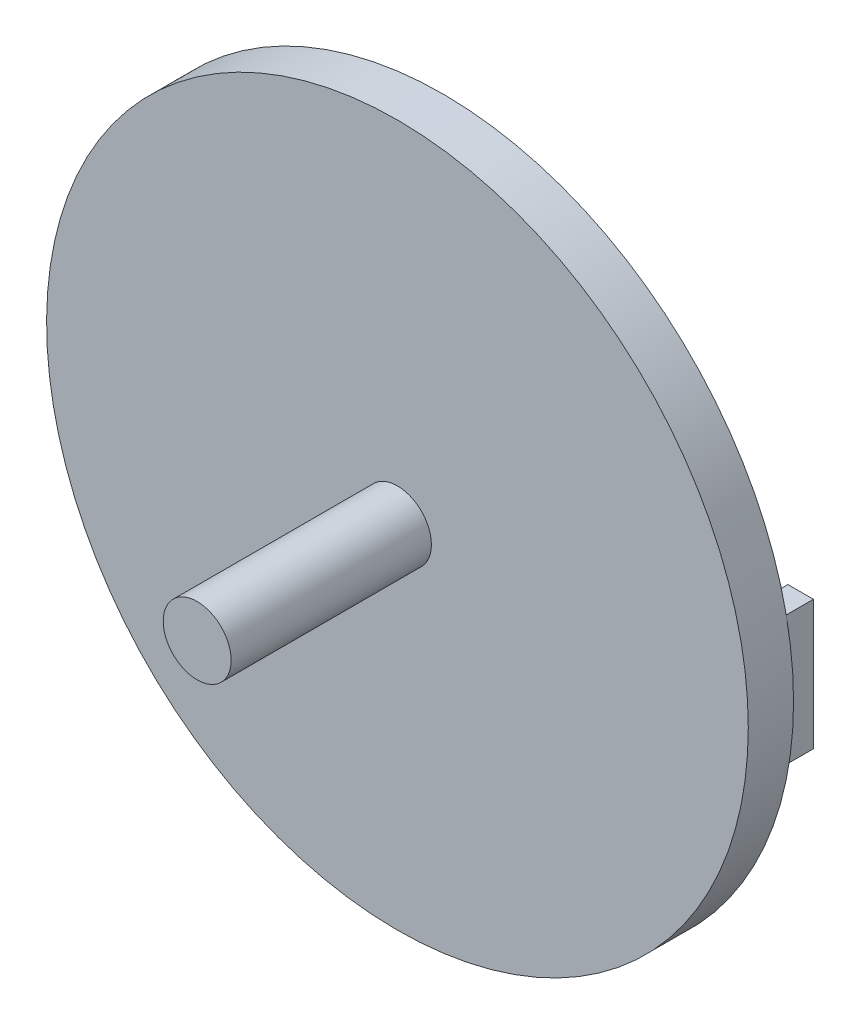
ISO-10303-21;
HEADER;
FILE_DESCRIPTION(('STEP AP214'),'2;1');
FILE_NAME('part.step','',(''),(''),'','','');
FILE_SCHEMA(('AUTOMOTIVE_DESIGN { 1 0 10303 214 1 1 1 1 }'));
ENDSEC;
DATA;
#1=APPLICATION_CONTEXT('core data for automotive mechanical design processes');
#2=APPLICATION_PROTOCOL_DEFINITION('international standard','automotive_design',2000,#1);
#3=PRODUCT_CONTEXT('',#1,'mechanical');
#4=PRODUCT('Part','Part','',(#3));
#5=PRODUCT_RELATED_PRODUCT_CATEGORY('part','',(#4));
#6=PRODUCT_DEFINITION_FORMATION('','',#4);
#7=PRODUCT_DEFINITION_CONTEXT('part definition',#1,'design');
#8=PRODUCT_DEFINITION('design','',#6,#7);
#9=PRODUCT_DEFINITION_SHAPE('','',#8);
#10=(LENGTH_UNIT() NAMED_UNIT(*) SI_UNIT(.MILLI.,.METRE.));
#11=(NAMED_UNIT(*) PLANE_ANGLE_UNIT() SI_UNIT($,.RADIAN.));
#12=(NAMED_UNIT(*) SI_UNIT($,.STERADIAN.) SOLID_ANGLE_UNIT());
#13=UNCERTAINTY_MEASURE_WITH_UNIT(LENGTH_MEASURE(1.E-05),#10,'distance_accuracy_value','');
#14=(GEOMETRIC_REPRESENTATION_CONTEXT(3) GLOBAL_UNCERTAINTY_ASSIGNED_CONTEXT((#13)) GLOBAL_UNIT_ASSIGNED_CONTEXT((#10,
#11,#12)) REPRESENTATION_CONTEXT('',''));
#15=CARTESIAN_POINT('',(0.,0.,0.));
#16=DIRECTION('',(0.,0.,1.));
#17=DIRECTION('',(1.,0.,0.));
#18=AXIS2_PLACEMENT_3D('',#15,#16,#17);
#19=CARTESIAN_POINT('',(0.,0.,0.));
#20=DIRECTION('',(0.,0.,1.));
#21=DIRECTION('',(1.,0.,0.));
#22=AXIS2_PLACEMENT_3D('',#19,#20,#21);
#23=PLANE('',#22);
#24=CARTESIAN_POINT('',(0.,0.,0.));
#25=DIRECTION('',(0.,0.,-1.));
#26=DIRECTION('',(-1.,0.,0.));
#27=AXIS2_PLACEMENT_3D('',#24,#25,#26);
#28=CIRCLE('',#27,56.5);
#29=CARTESIAN_POINT('',(-56.5,0.,0.));
#30=VERTEX_POINT('',#29);
#31=EDGE_CURVE('E52',#30,#30,#28,.T.);
#32=ORIENTED_EDGE('',*,*,#31,.F.);
#33=EDGE_LOOP('',(#32));
#34=FACE_BOUND('',#33,.T.);
#35=DIRECTION('',(0.,-1.,0.));
#36=VECTOR('',#35,1.);
#37=CARTESIAN_POINT('',(-69.7533503343664,16.4566501119054,0.));
#38=LINE('',#37,#36);
#39=CARTESIAN_POINT('',(-69.7533503343664,16.4566501119054,0.));
#40=VERTEX_POINT('',#39);
#41=CARTESIAN_POINT('',(-69.7533503343664,-14.9428391352855,0.));
#42=VERTEX_POINT('',#41);
#43=EDGE_CURVE('E131',#40,#42,#38,.T.);
#44=ORIENTED_EDGE('',*,*,#43,.F.);
#45=DIRECTION('',(1.,0.,0.));
#46=VECTOR('',#45,1.);
#47=CARTESIAN_POINT('',(-69.7533503343664,16.4566501119054,0.));
#48=LINE('',#47,#46);
#49=CARTESIAN_POINT('',(-75.732612968881,16.4566501119054,0.));
#50=VERTEX_POINT('',#49);
#51=EDGE_CURVE('E128',#50,#40,#48,.T.);
#52=ORIENTED_EDGE('',*,*,#51,.F.);
#53=CARTESIAN_POINT('',(0.,0.,0.));
#54=DIRECTION('',(0.,0.,1.));
#55=DIRECTION('',(1.,0.,0.));
#56=AXIS2_PLACEMENT_3D('',#53,#54,#55);
#57=CIRCLE('',#56,77.5);
#58=CARTESIAN_POINT('',(75.8826443331564,15.7503742497658,0.));
#59=VERTEX_POINT('',#58);
#60=EDGE_CURVE('E47',#59,#50,#57,.T.);
#61=ORIENTED_EDGE('',*,*,#60,.F.);
#62=DIRECTION('',(1.,0.,0.));
#63=VECTOR('',#62,1.);
#64=CARTESIAN_POINT('',(75.8826443331564,15.7503742497658,0.));
#65=LINE('',#64,#63);
#66=CARTESIAN_POINT('',(70.2466496656337,15.7503742497658,0.));
#67=VERTEX_POINT('',#66);
#68=EDGE_CURVE('E154',#67,#59,#65,.T.);
#69=ORIENTED_EDGE('',*,*,#68,.F.);
#70=DIRECTION('',(0.,1.,0.));
#71=VECTOR('',#70,1.);
#72=CARTESIAN_POINT('',(70.2466496656337,15.7503742497658,0.));
#73=LINE('',#72,#71);
#74=CARTESIAN_POINT('',(70.2466496656337,-12.860005017206,0.));
#75=VERTEX_POINT('',#74);
#76=EDGE_CURVE('E157',#75,#67,#73,.T.);
#77=ORIENTED_EDGE('',*,*,#76,.F.);
#78=DIRECTION('',(-1.,0.,0.));
#79=VECTOR('',#78,1.);
#80=CARTESIAN_POINT('',(75.8826443331564,-12.860005017206,0.));
#81=LINE('',#80,#79);
#82=CARTESIAN_POINT('',(75.8826443331564,-12.860005017206,0.));
#83=VERTEX_POINT('',#82);
#84=EDGE_CURVE('E161',#83,#75,#81,.T.);
#85=ORIENTED_EDGE('',*,*,#84,.F.);
#86=DIRECTION('',(0.,-1.,0.));
#87=VECTOR('',#86,1.);
#88=CARTESIAN_POINT('',(75.8826443331564,15.7503742497658,0.));
#89=LINE('',#88,#87);
#90=EDGE_CURVE('E164',#59,#83,#89,.T.);
#91=ORIENTED_EDGE('',*,*,#90,.F.);
#92=EDGE_CURVE('E176',#50,#59,#57,.T.);
#93=ORIENTED_EDGE('',*,*,#92,.F.);
#94=DIRECTION('',(0.,1.,0.));
#95=VECTOR('',#94,1.);
#96=CARTESIAN_POINT('',(-75.732612968881,16.4566501119054,0.));
#97=LINE('',#96,#95);
#98=CARTESIAN_POINT('',(-75.732612968881,-14.9428391352855,0.));
#99=VERTEX_POINT('',#98);
#100=EDGE_CURVE('E65',#99,#50,#97,.T.);
#101=ORIENTED_EDGE('',*,*,#100,.F.);
#102=DIRECTION('',(-1.,0.,0.));
#103=VECTOR('',#102,1.);
#104=CARTESIAN_POINT('',(-69.7533503343664,-14.9428391352855,0.));
#105=LINE('',#104,#103);
#106=EDGE_CURVE('E60',#42,#99,#105,.T.);
#107=ORIENTED_EDGE('',*,*,#106,.F.);
#108=EDGE_LOOP('',(#44,#52,#61,#69,#77,#85,#91,#93,#101,#107));
#109=FACE_BOUND('',#108,.T.);
#110=ADVANCED_FACE('F43',(#34,#109),#23,.F.);
#111=CARTESIAN_POINT('',(0.,0.,10.));
#112=DIRECTION('',(0.,0.,-1.));
#113=DIRECTION('',(-1.,0.,0.));
#114=AXIS2_PLACEMENT_3D('',#111,#112,#113);
#115=CYLINDRICAL_SURFACE('',#114,77.5);
#116=CARTESIAN_POINT('',(0.,0.,10.));
#117=DIRECTION('',(0.,0.,1.));
#118=DIRECTION('',(1.,0.,0.));
#119=AXIS2_PLACEMENT_3D('',#116,#117,#118);
#120=CIRCLE('',#119,77.5);
#121=CARTESIAN_POINT('',(77.5,0.,10.));
#122=VERTEX_POINT('',#121);
#123=EDGE_CURVE('E178',#122,#122,#120,.T.);
#124=ORIENTED_EDGE('',*,*,#123,.F.);
#125=EDGE_LOOP('',(#124));
#126=FACE_BOUND('',#125,.T.);
#127=ORIENTED_EDGE('',*,*,#60,.T.);
#128=ORIENTED_EDGE('',*,*,#92,.T.);
#129=EDGE_LOOP('',(#127,#128));
#130=FACE_BOUND('',#129,.T.);
#131=ADVANCED_FACE('F45',(#126,#130),#115,.T.);
#132=CARTESIAN_POINT('',(0.,0.,10.));
#133=DIRECTION('',(0.,0.,1.));
#134=DIRECTION('',(1.,0.,0.));
#135=AXIS2_PLACEMENT_3D('',#132,#133,#134);
#136=PLANE('',#135);
#137=CARTESIAN_POINT('',(0.,0.,10.));
#138=DIRECTION('',(0.,0.,1.));
#139=DIRECTION('',(1.,0.,0.));
#140=AXIS2_PLACEMENT_3D('',#137,#138,#139);
#141=CIRCLE('',#140,7.5);
#142=CARTESIAN_POINT('',(7.5,0.,10.));
#143=VERTEX_POINT('',#142);
#144=EDGE_CURVE('E11',#143,#143,#141,.T.);
#145=ORIENTED_EDGE('',*,*,#144,.F.);
#146=EDGE_LOOP('',(#145));
#147=FACE_BOUND('',#146,.T.);
#148=ORIENTED_EDGE('',*,*,#123,.T.);
#149=EDGE_LOOP('',(#148));
#150=FACE_BOUND('',#149,.T.);
#151=ADVANCED_FACE('F218',(#147,#150),#136,.T.);
#152=CARTESIAN_POINT('',(0.,0.,-5.76418823342823));
#153=DIRECTION('',(0.,0.,1.));
#154=DIRECTION('',(1.,0.,0.));
#155=AXIS2_PLACEMENT_3D('',#152,#153,#154);
#156=CYLINDRICAL_SURFACE('',#155,56.5);
#157=CARTESIAN_POINT('',(0.,0.,-5.76418823342823));
#158=DIRECTION('',(0.,0.,-1.));
#159=DIRECTION('',(-1.,0.,0.));
#160=AXIS2_PLACEMENT_3D('',#157,#158,#159);
#161=CIRCLE('',#160,56.5);
#162=CARTESIAN_POINT('',(-56.5,0.,-5.76418823342823));
#163=VERTEX_POINT('',#162);
#164=EDGE_CURVE('E135',#163,#163,#161,.T.);
#165=ORIENTED_EDGE('',*,*,#164,.F.);
#166=EDGE_LOOP('',(#165));
#167=FACE_BOUND('',#166,.T.);
#168=ORIENTED_EDGE('',*,*,#31,.T.);
#169=EDGE_LOOP('',(#168));
#170=FACE_BOUND('',#169,.T.);
#171=ADVANCED_FACE('F224',(#167,#170),#156,.T.);
#172=CARTESIAN_POINT('',(0.,0.,-5.76418823342823));
#173=DIRECTION('',(0.,0.,-1.));
#174=DIRECTION('',(-1.,0.,0.));
#175=AXIS2_PLACEMENT_3D('',#172,#173,#174);
#176=PLANE('',#175);
#177=ORIENTED_EDGE('',*,*,#164,.T.);
#178=EDGE_LOOP('',(#177));
#179=FACE_BOUND('',#178,.T.);
#180=ADVANCED_FACE('F228',(#179),#176,.T.);
#181=CARTESIAN_POINT('',(0.,0.,54.2358117665718));
#182=DIRECTION('',(0.,0.,-1.));
#183=DIRECTION('',(-1.,0.,0.));
#184=AXIS2_PLACEMENT_3D('',#181,#182,#183);
#185=CYLINDRICAL_SURFACE('',#184,7.5);
#186=ORIENTED_EDGE('',*,*,#144,.T.);
#187=EDGE_LOOP('',(#186));
#188=FACE_BOUND('',#187,.T.);
#189=CARTESIAN_POINT('',(0.,0.,54.2358117665718));
#190=DIRECTION('',(0.,0.,-1.));
#191=DIRECTION('',(-1.,0.,0.));
#192=AXIS2_PLACEMENT_3D('',#189,#190,#191);
#193=CIRCLE('',#192,7.5);
#194=CARTESIAN_POINT('',(-7.5,0.,54.2358117665718));
#195=VERTEX_POINT('',#194);
#196=EDGE_CURVE('E132',#195,#195,#193,.T.);
#197=ORIENTED_EDGE('',*,*,#196,.T.);
#198=EDGE_LOOP('',(#197));
#199=FACE_BOUND('',#198,.T.);
#200=ADVANCED_FACE('F232',(#188,#199),#185,.T.);
#201=CARTESIAN_POINT('',(0.,0.,54.2358117665718));
#202=DIRECTION('',(0.,0.,-1.));
#203=DIRECTION('',(-1.,0.,0.));
#204=AXIS2_PLACEMENT_3D('',#201,#202,#203);
#205=PLANE('',#204);
#206=ORIENTED_EDGE('',*,*,#196,.F.);
#207=EDGE_LOOP('',(#206));
#208=FACE_BOUND('',#207,.T.);
#209=ADVANCED_FACE('F210',(#208),#205,.F.);
#210=CARTESIAN_POINT('',(75.8826443331564,15.7503742497658,-6.));
#211=DIRECTION('',(-1.,0.,0.));
#212=DIRECTION('',(0.,0.,1.));
#213=AXIS2_PLACEMENT_3D('',#210,#211,#212);
#214=PLANE('',#213);
#215=ORIENTED_EDGE('',*,*,#90,.T.);
#216=DIRECTION('',(0.,0.,1.));
#217=VECTOR('',#216,1.);
#218=CARTESIAN_POINT('',(75.8826443331564,-12.860005017206,-6.));
#219=LINE('',#218,#217);
#220=CARTESIAN_POINT('',(75.8826443331564,-12.860005017206,-6.));
#221=VERTEX_POINT('',#220);
#222=EDGE_CURVE('E141',#221,#83,#219,.T.);
#223=ORIENTED_EDGE('',*,*,#222,.F.);
#224=DIRECTION('',(0.,-1.,0.));
#225=VECTOR('',#224,1.);
#226=CARTESIAN_POINT('',(75.8826443331564,15.7503742497658,-6.));
#227=LINE('',#226,#225);
#228=CARTESIAN_POINT('',(75.8826443331564,15.7503742497658,-6.));
#229=VERTEX_POINT('',#228);
#230=EDGE_CURVE('E158',#229,#221,#227,.T.);
#231=ORIENTED_EDGE('',*,*,#230,.F.);
#232=DIRECTION('',(0.,0.,1.));
#233=VECTOR('',#232,1.);
#234=CARTESIAN_POINT('',(75.8826443331564,15.7503742497658,-6.));
#235=LINE('',#234,#233);
#236=EDGE_CURVE('E150',#229,#59,#235,.T.);
#237=ORIENTED_EDGE('',*,*,#236,.T.);
#238=EDGE_LOOP('',(#215,#223,#231,#237));
#239=FACE_BOUND('',#238,.T.);
#240=ADVANCED_FACE('F194',(#239),#214,.F.);
#241=CARTESIAN_POINT('',(75.8826443331564,-12.860005017206,-6.));
#242=DIRECTION('',(0.,1.,0.));
#243=DIRECTION('',(0.,0.,1.));
#244=AXIS2_PLACEMENT_3D('',#241,#242,#243);
#245=PLANE('',#244);
#246=ORIENTED_EDGE('',*,*,#84,.T.);
#247=DIRECTION('',(0.,0.,1.));
#248=VECTOR('',#247,1.);
#249=CARTESIAN_POINT('',(70.2466496656337,-12.860005017206,-6.));
#250=LINE('',#249,#248);
#251=CARTESIAN_POINT('',(70.2466496656337,-12.860005017206,-6.));
#252=VERTEX_POINT('',#251);
#253=EDGE_CURVE('E144',#252,#75,#250,.T.);
#254=ORIENTED_EDGE('',*,*,#253,.F.);
#255=DIRECTION('',(-1.,0.,0.));
#256=VECTOR('',#255,1.);
#257=CARTESIAN_POINT('',(75.8826443331564,-12.860005017206,-6.));
#258=LINE('',#257,#256);
#259=EDGE_CURVE('E170',#221,#252,#258,.T.);
#260=ORIENTED_EDGE('',*,*,#259,.F.);
#261=ORIENTED_EDGE('',*,*,#222,.T.);
#262=EDGE_LOOP('',(#246,#254,#260,#261));
#263=FACE_BOUND('',#262,.T.);
#264=ADVANCED_FACE('F202',(#263),#245,.F.);
#265=CARTESIAN_POINT('',(70.2466496656337,15.7503742497658,-6.));
#266=DIRECTION('',(1.,0.,0.));
#267=DIRECTION('',(0.,0.,-1.));
#268=AXIS2_PLACEMENT_3D('',#265,#266,#267);
#269=PLANE('',#268);
#270=ORIENTED_EDGE('',*,*,#76,.T.);
#271=DIRECTION('',(0.,0.,1.));
#272=VECTOR('',#271,1.);
#273=CARTESIAN_POINT('',(70.2466496656337,15.7503742497658,-6.));
#274=LINE('',#273,#272);
#275=CARTESIAN_POINT('',(70.2466496656337,15.7503742497658,-6.));
#276=VERTEX_POINT('',#275);
#277=EDGE_CURVE('E147',#276,#67,#274,.T.);
#278=ORIENTED_EDGE('',*,*,#277,.F.);
#279=DIRECTION('',(0.,1.,0.));
#280=VECTOR('',#279,1.);
#281=CARTESIAN_POINT('',(70.2466496656337,15.7503742497658,-6.));
#282=LINE('',#281,#280);
#283=EDGE_CURVE('E168',#252,#276,#282,.T.);
#284=ORIENTED_EDGE('',*,*,#283,.F.);
#285=ORIENTED_EDGE('',*,*,#253,.T.);
#286=EDGE_LOOP('',(#270,#278,#284,#285));
#287=FACE_BOUND('',#286,.T.);
#288=ADVANCED_FACE('F200',(#287),#269,.F.);
#289=CARTESIAN_POINT('',(75.8826443331564,15.7503742497658,-6.));
#290=DIRECTION('',(0.,-1.,0.));
#291=DIRECTION('',(0.,0.,-1.));
#292=AXIS2_PLACEMENT_3D('',#289,#290,#291);
#293=PLANE('',#292);
#294=ORIENTED_EDGE('',*,*,#68,.T.);
#295=ORIENTED_EDGE('',*,*,#236,.F.);
#296=DIRECTION('',(1.,0.,0.));
#297=VECTOR('',#296,1.);
#298=CARTESIAN_POINT('',(75.8826443331564,15.7503742497658,-6.));
#299=LINE('',#298,#297);
#300=EDGE_CURVE('E153',#276,#229,#299,.T.);
#301=ORIENTED_EDGE('',*,*,#300,.F.);
#302=ORIENTED_EDGE('',*,*,#277,.T.);
#303=EDGE_LOOP('',(#294,#295,#301,#302));
#304=FACE_BOUND('',#303,.T.);
#305=ADVANCED_FACE('F190',(#304),#293,.F.);
#306=CARTESIAN_POINT('',(0.,0.,-6.));
#307=DIRECTION('',(0.,0.,-1.));
#308=DIRECTION('',(-1.,0.,0.));
#309=AXIS2_PLACEMENT_3D('',#306,#307,#308);
#310=PLANE('',#309);
#311=ORIENTED_EDGE('',*,*,#230,.T.);
#312=ORIENTED_EDGE('',*,*,#259,.T.);
#313=ORIENTED_EDGE('',*,*,#283,.T.);
#314=ORIENTED_EDGE('',*,*,#300,.T.);
#315=EDGE_LOOP('',(#311,#312,#313,#314));
#316=FACE_BOUND('',#315,.T.);
#317=ADVANCED_FACE('F196',(#316),#310,.T.);
#318=CARTESIAN_POINT('',(-69.7533503343664,16.4566501119054,-6.));
#319=DIRECTION('',(-1.,0.,0.));
#320=DIRECTION('',(0.,0.,1.));
#321=AXIS2_PLACEMENT_3D('',#318,#319,#320);
#322=PLANE('',#321);
#323=ORIENTED_EDGE('',*,*,#43,.T.);
#324=DIRECTION('',(0.,0.,1.));
#325=VECTOR('',#324,1.);
#326=CARTESIAN_POINT('',(-69.7533503343664,-14.9428391352855,-6.));
#327=LINE('',#326,#325);
#328=CARTESIAN_POINT('',(-69.7533503343664,-14.9428391352855,-6.));
#329=VERTEX_POINT('',#328);
#330=EDGE_CURVE('E112',#329,#42,#327,.T.);
#331=ORIENTED_EDGE('',*,*,#330,.F.);
#332=DIRECTION('',(0.,-1.,0.));
#333=VECTOR('',#332,1.);
#334=CARTESIAN_POINT('',(-69.7533503343664,16.4566501119054,-6.));
#335=LINE('',#334,#333);
#336=CARTESIAN_POINT('',(-69.7533503343664,16.4566501119054,-6.));
#337=VERTEX_POINT('',#336);
#338=EDGE_CURVE('E119',#337,#329,#335,.T.);
#339=ORIENTED_EDGE('',*,*,#338,.F.);
#340=DIRECTION('',(0.,0.,1.));
#341=VECTOR('',#340,1.);
#342=CARTESIAN_POINT('',(-69.7533503343664,16.4566501119054,-6.));
#343=LINE('',#342,#341);
#344=EDGE_CURVE('E356',#337,#40,#343,.T.);
#345=ORIENTED_EDGE('',*,*,#344,.T.);
#346=EDGE_LOOP('',(#323,#331,#339,#345));
#347=FACE_BOUND('',#346,.T.);
#348=ADVANCED_FACE('F130',(#347),#322,.F.);
#349=CARTESIAN_POINT('',(-69.7533503343664,-14.9428391352855,-6.));
#350=DIRECTION('',(0.,1.,0.));
#351=DIRECTION('',(0.,0.,1.));
#352=AXIS2_PLACEMENT_3D('',#349,#350,#351);
#353=PLANE('',#352);
#354=ORIENTED_EDGE('',*,*,#106,.T.);
#355=DIRECTION('',(0.,0.,1.));
#356=VECTOR('',#355,1.);
#357=CARTESIAN_POINT('',(-75.732612968881,-14.9428391352855,-6.));
#358=LINE('',#357,#356);
#359=CARTESIAN_POINT('',(-75.732612968881,-14.9428391352855,-6.));
#360=VERTEX_POINT('',#359);
#361=EDGE_CURVE('E115',#360,#99,#358,.T.);
#362=ORIENTED_EDGE('',*,*,#361,.F.);
#363=DIRECTION('',(-1.,0.,0.));
#364=VECTOR('',#363,1.);
#365=CARTESIAN_POINT('',(-69.7533503343664,-14.9428391352855,-6.));
#366=LINE('',#365,#364);
#367=EDGE_CURVE('E108',#329,#360,#366,.T.);
#368=ORIENTED_EDGE('',*,*,#367,.F.);
#369=ORIENTED_EDGE('',*,*,#330,.T.);
#370=EDGE_LOOP('',(#354,#362,#368,#369));
#371=FACE_BOUND('',#370,.T.);
#372=ADVANCED_FACE('F110',(#371),#353,.F.);
#373=CARTESIAN_POINT('',(-75.732612968881,16.4566501119054,-6.));
#374=DIRECTION('',(1.,0.,0.));
#375=DIRECTION('',(0.,0.,-1.));
#376=AXIS2_PLACEMENT_3D('',#373,#374,#375);
#377=PLANE('',#376);
#378=ORIENTED_EDGE('',*,*,#100,.T.);
#379=DIRECTION('',(0.,0.,1.));
#380=VECTOR('',#379,1.);
#381=CARTESIAN_POINT('',(-75.732612968881,16.4566501119054,-6.));
#382=LINE('',#381,#380);
#383=CARTESIAN_POINT('',(-75.732612968881,16.4566501119054,-6.));
#384=VERTEX_POINT('',#383);
#385=EDGE_CURVE('E137',#384,#50,#382,.T.);
#386=ORIENTED_EDGE('',*,*,#385,.F.);
#387=DIRECTION('',(0.,1.,0.));
#388=VECTOR('',#387,1.);
#389=CARTESIAN_POINT('',(-75.732612968881,16.4566501119054,-6.));
#390=LINE('',#389,#388);
#391=EDGE_CURVE('E118',#360,#384,#390,.T.);
#392=ORIENTED_EDGE('',*,*,#391,.F.);
#393=ORIENTED_EDGE('',*,*,#361,.T.);
#394=EDGE_LOOP('',(#378,#386,#392,#393));
#395=FACE_BOUND('',#394,.T.);
#396=ADVANCED_FACE('F265',(#395),#377,.F.);
#397=CARTESIAN_POINT('',(-69.7533503343664,16.4566501119054,-6.));
#398=DIRECTION('',(0.,-1.,0.));
#399=DIRECTION('',(0.,0.,-1.));
#400=AXIS2_PLACEMENT_3D('',#397,#398,#399);
#401=PLANE('',#400);
#402=ORIENTED_EDGE('',*,*,#51,.T.);
#403=ORIENTED_EDGE('',*,*,#344,.F.);
#404=DIRECTION('',(1.,0.,0.));
#405=VECTOR('',#404,1.);
#406=CARTESIAN_POINT('',(-69.7533503343664,16.4566501119054,-6.));
#407=LINE('',#406,#405);
#408=EDGE_CURVE('E124',#384,#337,#407,.T.);
#409=ORIENTED_EDGE('',*,*,#408,.F.);
#410=ORIENTED_EDGE('',*,*,#385,.T.);
#411=EDGE_LOOP('',(#402,#403,#409,#410));
#412=FACE_BOUND('',#411,.T.);
#413=ADVANCED_FACE('F273',(#412),#401,.F.);
#414=CARTESIAN_POINT('',(0.,0.,-6.));
#415=DIRECTION('',(0.,0.,-1.));
#416=DIRECTION('',(-1.,0.,0.));
#417=AXIS2_PLACEMENT_3D('',#414,#415,#416);
#418=PLANE('',#417);
#419=ORIENTED_EDGE('',*,*,#338,.T.);
#420=ORIENTED_EDGE('',*,*,#367,.T.);
#421=ORIENTED_EDGE('',*,*,#391,.T.);
#422=ORIENTED_EDGE('',*,*,#408,.T.);
#423=EDGE_LOOP('',(#419,#420,#421,#422));
#424=FACE_BOUND('',#423,.T.);
#425=ADVANCED_FACE('F122',(#424),#418,.T.);
#426=CLOSED_SHELL('',(#110,#131,#151,#171,#180,#200,#209,#240,#264,#288,#305,#317,#348,#372,
#396,#413,#425));
#427=MANIFOLD_SOLID_BREP('B2',#426);
#428=ADVANCED_BREP_SHAPE_REPRESENTATION('',(#18,#427),#14);
#429=SHAPE_DEFINITION_REPRESENTATION(#9,#428);
ENDSEC;
END-ISO-10303-21;
